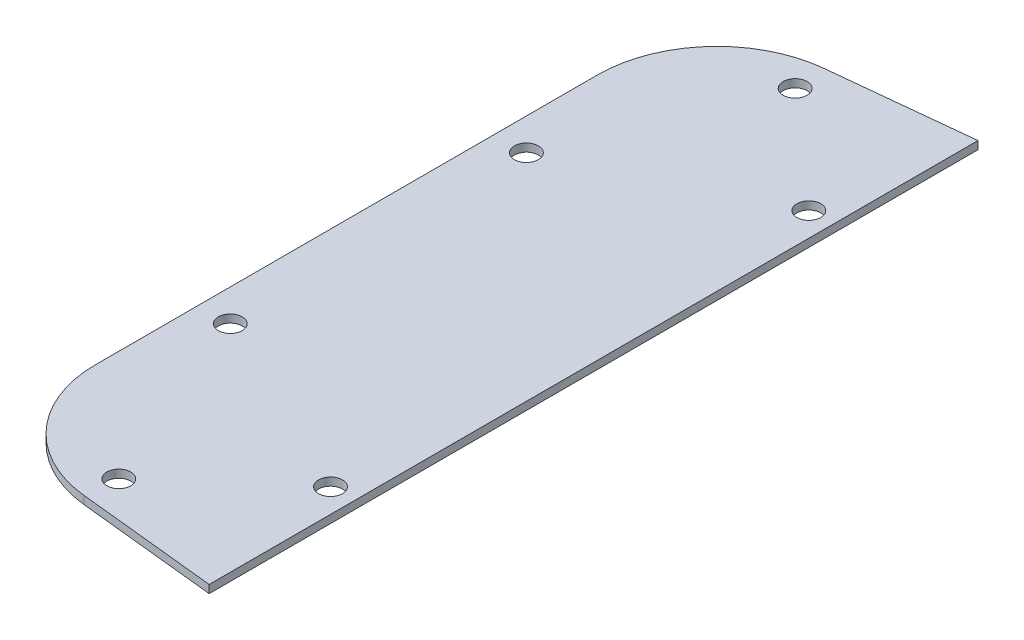
ISO-10303-21;
HEADER;
FILE_DESCRIPTION(('STEP AP214'),'2;1');
FILE_NAME('part.step','',(''),(''),'','','');
FILE_SCHEMA(('AUTOMOTIVE_DESIGN { 1 0 10303 214 1 1 1 1 }'));
ENDSEC;
DATA;
#1=APPLICATION_CONTEXT('core data for automotive mechanical design processes');
#2=APPLICATION_PROTOCOL_DEFINITION('international standard','automotive_design',2000,#1);
#3=PRODUCT_CONTEXT('',#1,'mechanical');
#4=PRODUCT('Part','Part','',(#3));
#5=PRODUCT_RELATED_PRODUCT_CATEGORY('part','',(#4));
#6=PRODUCT_DEFINITION_FORMATION('','',#4);
#7=PRODUCT_DEFINITION_CONTEXT('part definition',#1,'design');
#8=PRODUCT_DEFINITION('design','',#6,#7);
#9=PRODUCT_DEFINITION_SHAPE('','',#8);
#10=(LENGTH_UNIT() NAMED_UNIT(*) SI_UNIT(.MILLI.,.METRE.));
#11=(NAMED_UNIT(*) PLANE_ANGLE_UNIT() SI_UNIT($,.RADIAN.));
#12=(NAMED_UNIT(*) SI_UNIT($,.STERADIAN.) SOLID_ANGLE_UNIT());
#13=UNCERTAINTY_MEASURE_WITH_UNIT(LENGTH_MEASURE(1.E-05),#10,'distance_accuracy_value','');
#14=(GEOMETRIC_REPRESENTATION_CONTEXT(3) GLOBAL_UNCERTAINTY_ASSIGNED_CONTEXT((#13)) GLOBAL_UNIT_ASSIGNED_CONTEXT((#10,
#11,#12)) REPRESENTATION_CONTEXT('',''));
#15=CARTESIAN_POINT('',(0.,0.,0.));
#16=DIRECTION('',(0.,0.,1.));
#17=DIRECTION('',(1.,0.,0.));
#18=AXIS2_PLACEMENT_3D('',#15,#16,#17);
#19=CARTESIAN_POINT('',(-0.499999999999999,0.,32.3589866599045));
#20=DIRECTION('',(0.,1.,0.));
#21=DIRECTION('',(0.,0.,1.));
#22=AXIS2_PLACEMENT_3D('',#19,#20,#21);
#23=PLANE('',#22);
#24=DIRECTION('',(0.,0.,-1.));
#25=VECTOR('',#24,1.);
#26=CARTESIAN_POINT('',(15.5,0.,-47.3423511672905));
#27=LINE('',#26,#25);
#28=CARTESIAN_POINT('',(15.5,0.,49.1031933871649));
#29=VERTEX_POINT('',#28);
#30=CARTESIAN_POINT('',(15.5,0.,-47.3423511672905));
#31=VERTEX_POINT('',#30);
#32=EDGE_CURVE('E214',#29,#31,#27,.T.);
#33=ORIENTED_EDGE('',*,*,#32,.F.);
#34=DIRECTION('',(0.994639530123466,0.,0.103403119468281));
#35=VECTOR('',#34,1.);
#36=CARTESIAN_POINT('',(-2.05104679202422,0.,47.2785796117564));
#37=LINE('',#36,#35);
#38=CARTESIAN_POINT('',(-2.05104679202422,0.,47.2785796117564));
#39=VERTEX_POINT('',#38);
#40=EDGE_CURVE('E255',#39,#29,#37,.T.);
#41=ORIENTED_EDGE('',*,*,#40,.F.);
#42=CARTESIAN_POINT('',(-0.499999999999999,0.,32.3589866599045));
#43=DIRECTION('',(0.,1.,0.));
#44=DIRECTION('',(0.,0.,1.));
#45=AXIS2_PLACEMENT_3D('',#42,#43,#44);
#46=CIRCLE('',#45,15.);
#47=CARTESIAN_POINT('',(-15.5,0.,32.3589866599045));
#48=VERTEX_POINT('',#47);
#49=EDGE_CURVE('E283',#48,#39,#46,.T.);
#50=ORIENTED_EDGE('',*,*,#49,.F.);
#51=DIRECTION('',(0.,0.,1.));
#52=VECTOR('',#51,1.);
#53=CARTESIAN_POINT('',(-15.5,0.,-30.5981444400301));
#54=LINE('',#53,#52);
#55=CARTESIAN_POINT('',(-15.5,0.,-30.5981444400301));
#56=VERTEX_POINT('',#55);
#57=EDGE_CURVE('E280',#56,#48,#54,.T.);
#58=ORIENTED_EDGE('',*,*,#57,.F.);
#59=CARTESIAN_POINT('',(-0.500000000000002,0.,-30.5981444400301));
#60=DIRECTION('',(0.,1.,0.));
#61=DIRECTION('',(0.,0.,1.));
#62=AXIS2_PLACEMENT_3D('',#59,#60,#61);
#63=CIRCLE('',#62,15.);
#64=CARTESIAN_POINT('',(-2.05104679202422,0.,-45.5177373918821));
#65=VERTEX_POINT('',#64);
#66=EDGE_CURVE('E277',#65,#56,#63,.T.);
#67=ORIENTED_EDGE('',*,*,#66,.F.);
#68=DIRECTION('',(-0.994639530123466,0.,0.103403119468281));
#69=VECTOR('',#68,1.);
#70=CARTESIAN_POINT('',(15.5,0.,-47.3423511672905));
#71=LINE('',#70,#69);
#72=EDGE_CURVE('E274',#31,#65,#71,.T.);
#73=ORIENTED_EDGE('',*,*,#72,.F.);
#74=EDGE_LOOP('',(#33,#41,#50,#58,#67,#73));
#75=FACE_BOUND('',#74,.T.);
#76=CARTESIAN_POINT('',(-11.5,0.,-17.6949521456316));
#77=DIRECTION('',(0.,1.,0.));
#78=DIRECTION('',(0.,0.,1.));
#79=AXIS2_PLACEMENT_3D('',#76,#77,#78);
#80=CIRCLE('',#79,1.5);
#81=CARTESIAN_POINT('',(-11.5,0.,-16.1949521456316));
#82=VERTEX_POINT('',#81);
#83=EDGE_CURVE('E220',#82,#82,#80,.F.);
#84=ORIENTED_EDGE('',*,*,#83,.F.);
#85=EDGE_LOOP('',(#84));
#86=FACE_BOUND('',#85,.T.);
#87=CARTESIAN_POINT('',(-11.5,0.,19.455794365506));
#88=DIRECTION('',(0.,1.,0.));
#89=DIRECTION('',(0.,0.,1.));
#90=AXIS2_PLACEMENT_3D('',#87,#88,#89);
#91=CIRCLE('',#90,1.5);
#92=CARTESIAN_POINT('',(-11.5,0.,20.955794365506));
#93=VERTEX_POINT('',#92);
#94=EDGE_CURVE('E228',#93,#93,#91,.F.);
#95=ORIENTED_EDGE('',*,*,#94,.F.);
#96=EDGE_LOOP('',(#95));
#97=FACE_BOUND('',#96,.T.);
#98=CARTESIAN_POINT('',(-1.63743431415109,0.,43.3000214912626));
#99=DIRECTION('',(0.,1.,0.));
#100=DIRECTION('',(0.,0.,1.));
#101=AXIS2_PLACEMENT_3D('',#98,#99,#100);
#102=CIRCLE('',#101,1.5);
#103=CARTESIAN_POINT('',(-1.63743431415109,0.,44.8000214912626));
#104=VERTEX_POINT('',#103);
#105=EDGE_CURVE('E236',#104,#104,#102,.F.);
#106=ORIENTED_EDGE('',*,*,#105,.F.);
#107=EDGE_LOOP('',(#106));
#108=FACE_BOUND('',#107,.T.);
#109=CARTESIAN_POINT('',(12.5,0.,-29.1195788900628));
#110=DIRECTION('',(0.,1.,0.));
#111=DIRECTION('',(0.,0.,1.));
#112=AXIS2_PLACEMENT_3D('',#109,#110,#111);
#113=CIRCLE('',#112,1.5);
#114=CARTESIAN_POINT('',(12.5,0.,-27.6195788900628));
#115=VERTEX_POINT('',#114);
#116=EDGE_CURVE('E219',#115,#115,#113,.F.);
#117=ORIENTED_EDGE('',*,*,#116,.F.);
#118=EDGE_LOOP('',(#117));
#119=FACE_BOUND('',#118,.T.);
#120=CARTESIAN_POINT('',(12.5,0.,30.8804211099372));
#121=DIRECTION('',(0.,1.,0.));
#122=DIRECTION('',(0.,0.,1.));
#123=AXIS2_PLACEMENT_3D('',#120,#121,#122);
#124=CIRCLE('',#123,1.5);
#125=CARTESIAN_POINT('',(12.5,0.,32.3804211099372));
#126=VERTEX_POINT('',#125);
#127=EDGE_CURVE('E195',#126,#126,#124,.F.);
#128=ORIENTED_EDGE('',*,*,#127,.F.);
#129=EDGE_LOOP('',(#128));
#130=FACE_BOUND('',#129,.T.);
#131=CARTESIAN_POINT('',(-1.63743431415109,0.,-41.5391792713882));
#132=DIRECTION('',(0.,1.,0.));
#133=DIRECTION('',(0.,0.,1.));
#134=AXIS2_PLACEMENT_3D('',#131,#132,#133);
#135=CIRCLE('',#134,1.5);
#136=CARTESIAN_POINT('',(-1.63743431415109,0.,-40.0391792713882));
#137=VERTEX_POINT('',#136);
#138=EDGE_CURVE('E210',#137,#137,#135,.F.);
#139=ORIENTED_EDGE('',*,*,#138,.F.);
#140=EDGE_LOOP('',(#139));
#141=FACE_BOUND('',#140,.T.);
#142=CARTESIAN_POINT('',(-11.5,0.,-17.6949521456316));
#143=DIRECTION('',(0.,1.,0.));
#144=DIRECTION('',(0.,0.,-1.));
#145=AXIS2_PLACEMENT_3D('',#142,#143,#144);
#146=CIRCLE('',#145,2.75);
#147=CARTESIAN_POINT('',(-11.3,0.,-14.9522345152511));
#148=VERTEX_POINT('',#147);
#149=CARTESIAN_POINT('',(-11.3,0.,-20.4376697760121));
#150=VERTEX_POINT('',#149);
#151=EDGE_CURVE('E193',#148,#150,#146,.T.);
#152=ORIENTED_EDGE('',*,*,#151,.F.);
#153=DIRECTION('',(0.,0.,-1.));
#154=VECTOR('',#153,1.);
#155=CARTESIAN_POINT('',(-11.3,0.,-14.9522345152511));
#156=LINE('',#155,#154);
#157=CARTESIAN_POINT('',(-11.3,0.,16.7130767351255));
#158=VERTEX_POINT('',#157);
#159=EDGE_CURVE('E190',#158,#148,#156,.T.);
#160=ORIENTED_EDGE('',*,*,#159,.F.);
#161=CARTESIAN_POINT('',(-11.5,0.,19.455794365506));
#162=DIRECTION('',(0.,1.,0.));
#163=DIRECTION('',(0.,0.,-1.));
#164=AXIS2_PLACEMENT_3D('',#161,#162,#163);
#165=CIRCLE('',#164,2.75);
#166=CARTESIAN_POINT('',(-11.3,0.,22.1985119958865));
#167=VERTEX_POINT('',#166);
#168=EDGE_CURVE('E589',#167,#158,#165,.T.);
#169=ORIENTED_EDGE('',*,*,#168,.F.);
#170=DIRECTION('',(0.,0.,-1.));
#171=VECTOR('',#170,1.);
#172=CARTESIAN_POINT('',(-11.3,0.,22.1985119958865));
#173=LINE('',#172,#171);
#174=CARTESIAN_POINT('',(-11.3,0.,32.3589866599045));
#175=VERTEX_POINT('',#174);
#176=EDGE_CURVE('E663',#175,#167,#173,.T.);
#177=ORIENTED_EDGE('',*,*,#176,.F.);
#178=CARTESIAN_POINT('',(-0.499999999999999,0.,32.3589866599045));
#179=DIRECTION('',(0.,-1.,0.));
#180=DIRECTION('',(0.,0.,-1.));
#181=AXIS2_PLACEMENT_3D('',#178,#179,#180);
#182=CIRCLE('',#181,10.8);
#183=CARTESIAN_POINT('',(-4.26301770773381,0.,42.4822123183239));
#184=VERTEX_POINT('',#183);
#185=EDGE_CURVE('E659',#184,#175,#182,.T.);
#186=ORIENTED_EDGE('',*,*,#185,.F.);
#187=CARTESIAN_POINT('',(-1.63743431415109,0.,43.3000214912626));
#188=DIRECTION('',(0.,1.,0.));
#189=DIRECTION('',(0.,0.,-1.));
#190=AXIS2_PLACEMENT_3D('',#187,#188,#189);
#191=CIRCLE('',#190,2.75);
#192=CARTESIAN_POINT('',(1.11126168488556,0.,43.3846991440399));
#193=VERTEX_POINT('',#192);
#194=EDGE_CURVE('E655',#193,#184,#191,.T.);
#195=ORIENTED_EDGE('',*,*,#194,.F.);
#196=DIRECTION('',(-0.994639530123465,0.,-0.103403119468282));
#197=VECTOR('',#196,1.);
#198=CARTESIAN_POINT('',(1.11126168488556,0.,43.3846991440399));
#199=LINE('',#198,#197);
#200=CARTESIAN_POINT('',(9.3,0.,44.2360036223439));
#201=VERTEX_POINT('',#200);
#202=EDGE_CURVE('E651',#201,#193,#199,.T.);
#203=ORIENTED_EDGE('',*,*,#202,.F.);
#204=DIRECTION('',(0.,0.,1.));
#205=VECTOR('',#204,1.);
#206=CARTESIAN_POINT('',(9.3,0.,44.2360036223439));
#207=LINE('',#206,#205);
#208=CARTESIAN_POINT('',(9.29999999999999,0.,-42.4751614024695));
#209=VERTEX_POINT('',#208);
#210=EDGE_CURVE('E647',#209,#201,#207,.T.);
#211=ORIENTED_EDGE('',*,*,#210,.F.);
#212=DIRECTION('',(0.994639530123466,0.,-0.103403119468281));
#213=VECTOR('',#212,1.);
#214=CARTESIAN_POINT('',(9.29999999999999,0.,-42.4751614024695));
#215=LINE('',#214,#213);
#216=CARTESIAN_POINT('',(1.11126168488556,0.,-41.6238569241655));
#217=VERTEX_POINT('',#216);
#218=EDGE_CURVE('E639',#217,#209,#215,.T.);
#219=ORIENTED_EDGE('',*,*,#218,.F.);
#220=CARTESIAN_POINT('',(-1.63743431415109,0.,-41.5391792713882));
#221=DIRECTION('',(0.,1.,0.));
#222=DIRECTION('',(0.,0.,-1.));
#223=AXIS2_PLACEMENT_3D('',#220,#221,#222);
#224=CIRCLE('',#223,2.75);
#225=CARTESIAN_POINT('',(-4.26301770773382,0.,-40.7213700984495));
#226=VERTEX_POINT('',#225);
#227=EDGE_CURVE('E633',#226,#217,#224,.T.);
#228=ORIENTED_EDGE('',*,*,#227,.F.);
#229=CARTESIAN_POINT('',(-0.500000000000002,0.,-30.5981444400301));
#230=DIRECTION('',(0.,-1.,0.));
#231=DIRECTION('',(0.,0.,-1.));
#232=AXIS2_PLACEMENT_3D('',#229,#230,#231);
#233=CIRCLE('',#232,10.8);
#234=CARTESIAN_POINT('',(-11.3,0.,-30.5981444400301));
#235=VERTEX_POINT('',#234);
#236=EDGE_CURVE('E66',#235,#226,#233,.T.);
#237=ORIENTED_EDGE('',*,*,#236,.F.);
#238=DIRECTION('',(0.,0.,-1.));
#239=VECTOR('',#238,1.);
#240=CARTESIAN_POINT('',(-11.3,0.,-30.5981444400301));
#241=LINE('',#240,#239);
#242=EDGE_CURVE('E61',#150,#235,#241,.T.);
#243=ORIENTED_EDGE('',*,*,#242,.F.);
#244=EDGE_LOOP('',(#152,#160,#169,#177,#186,#195,#203,#211,#219,#228,#237,#243));
#245=FACE_BOUND('',#244,.T.);
#246=ADVANCED_FACE('F45',(#75,#86,#97,#108,#119,#130,#141,#245),#23,.F.);
#247=CARTESIAN_POINT('',(15.5,1.,-47.3423511672905));
#248=DIRECTION('',(-1.,0.,0.));
#249=DIRECTION('',(0.,0.,1.));
#250=AXIS2_PLACEMENT_3D('',#247,#248,#249);
#251=PLANE('',#250);
#252=ORIENTED_EDGE('',*,*,#32,.T.);
#253=DIRECTION('',(0.,-1.,0.));
#254=VECTOR('',#253,1.);
#255=CARTESIAN_POINT('',(15.5,1.,-47.3423511672905));
#256=LINE('',#255,#254);
#257=CARTESIAN_POINT('',(15.5,1.,-47.3423511672905));
#258=VERTEX_POINT('',#257);
#259=EDGE_CURVE('E11',#258,#31,#256,.T.);
#260=ORIENTED_EDGE('',*,*,#259,.F.);
#261=DIRECTION('',(0.,0.,-1.));
#262=VECTOR('',#261,1.);
#263=CARTESIAN_POINT('',(15.5,1.,-47.3423511672905));
#264=LINE('',#263,#262);
#265=CARTESIAN_POINT('',(15.5,1.,49.1031933871649));
#266=VERTEX_POINT('',#265);
#267=EDGE_CURVE('E250',#266,#258,#264,.T.);
#268=ORIENTED_EDGE('',*,*,#267,.F.);
#269=DIRECTION('',(0.,-1.,0.));
#270=VECTOR('',#269,1.);
#271=CARTESIAN_POINT('',(15.5,1.,49.1031933871649));
#272=LINE('',#271,#270);
#273=EDGE_CURVE('E270',#266,#29,#272,.T.);
#274=ORIENTED_EDGE('',*,*,#273,.T.);
#275=EDGE_LOOP('',(#252,#260,#268,#274));
#276=FACE_BOUND('',#275,.T.);
#277=ADVANCED_FACE('F47',(#276),#251,.F.);
#278=CARTESIAN_POINT('',(15.5,1.,-47.3423511672905));
#279=DIRECTION('',(0.103403119468281,0.,0.994639530123466));
#280=DIRECTION('',(0.994639530123466,0.,-0.103403119468281));
#281=AXIS2_PLACEMENT_3D('',#278,#279,#280);
#282=PLANE('',#281);
#283=ORIENTED_EDGE('',*,*,#72,.T.);
#284=DIRECTION('',(0.,-1.,0.));
#285=VECTOR('',#284,1.);
#286=CARTESIAN_POINT('',(-2.05104679202422,1.,-45.5177373918821));
#287=LINE('',#286,#285);
#288=CARTESIAN_POINT('',(-2.05104679202422,1.,-45.5177373918821));
#289=VERTEX_POINT('',#288);
#290=EDGE_CURVE('E54',#289,#65,#287,.T.);
#291=ORIENTED_EDGE('',*,*,#290,.F.);
#292=DIRECTION('',(-0.994639530123466,0.,0.103403119468281));
#293=VECTOR('',#292,1.);
#294=CARTESIAN_POINT('',(15.5,1.,-47.3423511672905));
#295=LINE('',#294,#293);
#296=EDGE_CURVE('E254',#258,#289,#295,.T.);
#297=ORIENTED_EDGE('',*,*,#296,.F.);
#298=ORIENTED_EDGE('',*,*,#259,.T.);
#299=EDGE_LOOP('',(#283,#291,#297,#298));
#300=FACE_BOUND('',#299,.T.);
#301=ADVANCED_FACE('F331',(#300),#282,.F.);
#302=CARTESIAN_POINT('',(-0.500000000000002,1.,-30.5981444400301));
#303=DIRECTION('',(0.,-1.,0.));
#304=DIRECTION('',(0.,0.,-1.));
#305=AXIS2_PLACEMENT_3D('',#302,#303,#304);
#306=CYLINDRICAL_SURFACE('',#305,15.);
#307=ORIENTED_EDGE('',*,*,#66,.T.);
#308=DIRECTION('',(0.,-1.,0.));
#309=VECTOR('',#308,1.);
#310=CARTESIAN_POINT('',(-15.5,1.,-30.5981444400301));
#311=LINE('',#310,#309);
#312=CARTESIAN_POINT('',(-15.5,1.,-30.5981444400301));
#313=VERTEX_POINT('',#312);
#314=EDGE_CURVE('E299',#313,#56,#311,.T.);
#315=ORIENTED_EDGE('',*,*,#314,.F.);
#316=CARTESIAN_POINT('',(-0.500000000000002,1.,-30.5981444400301));
#317=DIRECTION('',(0.,1.,0.));
#318=DIRECTION('',(0.,0.,1.));
#319=AXIS2_PLACEMENT_3D('',#316,#317,#318);
#320=CIRCLE('',#319,15.);
#321=EDGE_CURVE('E258',#289,#313,#320,.T.);
#322=ORIENTED_EDGE('',*,*,#321,.F.);
#323=ORIENTED_EDGE('',*,*,#290,.T.);
#324=EDGE_LOOP('',(#307,#315,#322,#323));
#325=FACE_BOUND('',#324,.T.);
#326=ADVANCED_FACE('F308',(#325),#306,.T.);
#327=CARTESIAN_POINT('',(-15.5,1.,-30.5981444400301));
#328=DIRECTION('',(1.,0.,0.));
#329=DIRECTION('',(0.,0.,-1.));
#330=AXIS2_PLACEMENT_3D('',#327,#328,#329);
#331=PLANE('',#330);
#332=ORIENTED_EDGE('',*,*,#57,.T.);
#333=DIRECTION('',(0.,-1.,0.));
#334=VECTOR('',#333,1.);
#335=CARTESIAN_POINT('',(-15.5,1.,32.3589866599045));
#336=LINE('',#335,#334);
#337=CARTESIAN_POINT('',(-15.5,1.,32.3589866599045));
#338=VERTEX_POINT('',#337);
#339=EDGE_CURVE('E295',#338,#48,#336,.T.);
#340=ORIENTED_EDGE('',*,*,#339,.F.);
#341=DIRECTION('',(0.,0.,1.));
#342=VECTOR('',#341,1.);
#343=CARTESIAN_POINT('',(-15.5,1.,-30.5981444400301));
#344=LINE('',#343,#342);
#345=EDGE_CURVE('E261',#313,#338,#344,.T.);
#346=ORIENTED_EDGE('',*,*,#345,.F.);
#347=ORIENTED_EDGE('',*,*,#314,.T.);
#348=EDGE_LOOP('',(#332,#340,#346,#347));
#349=FACE_BOUND('',#348,.T.);
#350=ADVANCED_FACE('F319',(#349),#331,.F.);
#351=CARTESIAN_POINT('',(-0.499999999999999,1.,32.3589866599045));
#352=DIRECTION('',(0.,-1.,0.));
#353=DIRECTION('',(0.,0.,-1.));
#354=AXIS2_PLACEMENT_3D('',#351,#352,#353);
#355=CYLINDRICAL_SURFACE('',#354,15.);
#356=ORIENTED_EDGE('',*,*,#49,.T.);
#357=DIRECTION('',(0.,-1.,0.));
#358=VECTOR('',#357,1.);
#359=CARTESIAN_POINT('',(-2.05104679202422,1.,47.2785796117564));
#360=LINE('',#359,#358);
#361=CARTESIAN_POINT('',(-2.05104679202422,1.,47.2785796117564));
#362=VERTEX_POINT('',#361);
#363=EDGE_CURVE('E291',#362,#39,#360,.T.);
#364=ORIENTED_EDGE('',*,*,#363,.F.);
#365=CARTESIAN_POINT('',(-0.499999999999999,1.,32.3589866599045));
#366=DIRECTION('',(0.,1.,0.));
#367=DIRECTION('',(0.,0.,1.));
#368=AXIS2_PLACEMENT_3D('',#365,#366,#367);
#369=CIRCLE('',#368,15.);
#370=EDGE_CURVE('E264',#338,#362,#369,.T.);
#371=ORIENTED_EDGE('',*,*,#370,.F.);
#372=ORIENTED_EDGE('',*,*,#339,.T.);
#373=EDGE_LOOP('',(#356,#364,#371,#372));
#374=FACE_BOUND('',#373,.T.);
#375=ADVANCED_FACE('F323',(#374),#355,.T.);
#376=CARTESIAN_POINT('',(-2.05104679202422,1.,47.2785796117564));
#377=DIRECTION('',(0.103403119468281,0.,-0.994639530123466));
#378=DIRECTION('',(-0.994639530123466,0.,-0.103403119468281));
#379=AXIS2_PLACEMENT_3D('',#376,#377,#378);
#380=PLANE('',#379);
#381=ORIENTED_EDGE('',*,*,#40,.T.);
#382=ORIENTED_EDGE('',*,*,#273,.F.);
#383=DIRECTION('',(0.994639530123466,0.,0.103403119468281));
#384=VECTOR('',#383,1.);
#385=CARTESIAN_POINT('',(-2.05104679202422,1.,47.2785796117564));
#386=LINE('',#385,#384);
#387=EDGE_CURVE('E267',#362,#266,#386,.T.);
#388=ORIENTED_EDGE('',*,*,#387,.F.);
#389=ORIENTED_EDGE('',*,*,#363,.T.);
#390=EDGE_LOOP('',(#381,#382,#388,#389));
#391=FACE_BOUND('',#390,.T.);
#392=ADVANCED_FACE('F334',(#391),#380,.F.);
#393=CARTESIAN_POINT('',(-0.499999999999999,1.,32.3589866599045));
#394=DIRECTION('',(0.,1.,0.));
#395=DIRECTION('',(0.,0.,1.));
#396=AXIS2_PLACEMENT_3D('',#393,#394,#395);
#397=PLANE('',#396);
#398=CARTESIAN_POINT('',(-1.63743431415109,1.,-41.5391792713882));
#399=DIRECTION('',(0.,1.,0.));
#400=DIRECTION('',(0.,0.,1.));
#401=AXIS2_PLACEMENT_3D('',#398,#399,#400);
#402=CIRCLE('',#401,1.5);
#403=CARTESIAN_POINT('',(-1.63743431415109,1.,-40.0391792713882));
#404=VERTEX_POINT('',#403);
#405=EDGE_CURVE('E206',#404,#404,#402,.T.);
#406=ORIENTED_EDGE('',*,*,#405,.F.);
#407=EDGE_LOOP('',(#406));
#408=FACE_BOUND('',#407,.T.);
#409=CARTESIAN_POINT('',(12.5,1.,30.8804211099372));
#410=DIRECTION('',(0.,1.,0.));
#411=DIRECTION('',(0.,0.,1.));
#412=AXIS2_PLACEMENT_3D('',#409,#410,#411);
#413=CIRCLE('',#412,1.5);
#414=CARTESIAN_POINT('',(12.5,1.,32.3804211099372));
#415=VERTEX_POINT('',#414);
#416=EDGE_CURVE('E200',#415,#415,#413,.T.);
#417=ORIENTED_EDGE('',*,*,#416,.F.);
#418=EDGE_LOOP('',(#417));
#419=FACE_BOUND('',#418,.T.);
#420=CARTESIAN_POINT('',(12.5,1.,-29.1195788900628));
#421=DIRECTION('',(0.,1.,0.));
#422=DIRECTION('',(0.,0.,1.));
#423=AXIS2_PLACEMENT_3D('',#420,#421,#422);
#424=CIRCLE('',#423,1.5);
#425=CARTESIAN_POINT('',(12.5,1.,-27.6195788900628));
#426=VERTEX_POINT('',#425);
#427=EDGE_CURVE('E240',#426,#426,#424,.T.);
#428=ORIENTED_EDGE('',*,*,#427,.F.);
#429=EDGE_LOOP('',(#428));
#430=FACE_BOUND('',#429,.T.);
#431=CARTESIAN_POINT('',(-1.63743431415109,1.,43.3000214912626));
#432=DIRECTION('',(0.,1.,0.));
#433=DIRECTION('',(0.,0.,1.));
#434=AXIS2_PLACEMENT_3D('',#431,#432,#433);
#435=CIRCLE('',#434,1.5);
#436=CARTESIAN_POINT('',(-1.63743431415109,1.,44.8000214912626));
#437=VERTEX_POINT('',#436);
#438=EDGE_CURVE('E232',#437,#437,#435,.T.);
#439=ORIENTED_EDGE('',*,*,#438,.F.);
#440=EDGE_LOOP('',(#439));
#441=FACE_BOUND('',#440,.T.);
#442=CARTESIAN_POINT('',(-11.5,1.,19.455794365506));
#443=DIRECTION('',(0.,1.,0.));
#444=DIRECTION('',(0.,0.,1.));
#445=AXIS2_PLACEMENT_3D('',#442,#443,#444);
#446=CIRCLE('',#445,1.5);
#447=CARTESIAN_POINT('',(-11.5,1.,20.955794365506));
#448=VERTEX_POINT('',#447);
#449=EDGE_CURVE('E224',#448,#448,#446,.T.);
#450=ORIENTED_EDGE('',*,*,#449,.F.);
#451=EDGE_LOOP('',(#450));
#452=FACE_BOUND('',#451,.T.);
#453=CARTESIAN_POINT('',(-11.5,1.,-17.6949521456316));
#454=DIRECTION('',(0.,1.,0.));
#455=DIRECTION('',(0.,0.,1.));
#456=AXIS2_PLACEMENT_3D('',#453,#454,#455);
#457=CIRCLE('',#456,1.5);
#458=CARTESIAN_POINT('',(-11.5,1.,-16.1949521456316));
#459=VERTEX_POINT('',#458);
#460=EDGE_CURVE('E211',#459,#459,#457,.T.);
#461=ORIENTED_EDGE('',*,*,#460,.F.);
#462=EDGE_LOOP('',(#461));
#463=FACE_BOUND('',#462,.T.);
#464=ORIENTED_EDGE('',*,*,#267,.T.);
#465=ORIENTED_EDGE('',*,*,#296,.T.);
#466=ORIENTED_EDGE('',*,*,#321,.T.);
#467=ORIENTED_EDGE('',*,*,#345,.T.);
#468=ORIENTED_EDGE('',*,*,#370,.T.);
#469=ORIENTED_EDGE('',*,*,#387,.T.);
#470=EDGE_LOOP('',(#464,#465,#466,#467,#468,#469));
#471=FACE_BOUND('',#470,.T.);
#472=ADVANCED_FACE('F327',(#408,#419,#430,#441,#452,#463,#471),#397,.T.);
#473=CARTESIAN_POINT('',(-11.5,-0.000999999999999916,-17.6949521456316));
#474=DIRECTION('',(0.,1.,0.));
#475=DIRECTION('',(0.,0.,1.));
#476=AXIS2_PLACEMENT_3D('',#473,#474,#475);
#477=CYLINDRICAL_SURFACE('',#476,1.5);
#478=ORIENTED_EDGE('',*,*,#460,.T.);
#479=EDGE_LOOP('',(#478));
#480=FACE_BOUND('',#479,.T.);
#481=ORIENTED_EDGE('',*,*,#83,.T.);
#482=EDGE_LOOP('',(#481));
#483=FACE_BOUND('',#482,.T.);
#484=ADVANCED_FACE('F341',(#480,#483),#477,.F.);
#485=CARTESIAN_POINT('',(-11.5,-0.000999999999999916,19.455794365506));
#486=DIRECTION('',(0.,1.,0.));
#487=DIRECTION('',(0.,0.,1.));
#488=AXIS2_PLACEMENT_3D('',#485,#486,#487);
#489=CYLINDRICAL_SURFACE('',#488,1.5);
#490=ORIENTED_EDGE('',*,*,#449,.T.);
#491=EDGE_LOOP('',(#490));
#492=FACE_BOUND('',#491,.T.);
#493=ORIENTED_EDGE('',*,*,#94,.T.);
#494=EDGE_LOOP('',(#493));
#495=FACE_BOUND('',#494,.T.);
#496=ADVANCED_FACE('F361',(#492,#495),#489,.F.);
#497=CARTESIAN_POINT('',(-1.63743431415109,-0.000999999999999916,43.3000214912626));
#498=DIRECTION('',(0.,1.,0.));
#499=DIRECTION('',(0.,0.,1.));
#500=AXIS2_PLACEMENT_3D('',#497,#498,#499);
#501=CYLINDRICAL_SURFACE('',#500,1.5);
#502=ORIENTED_EDGE('',*,*,#438,.T.);
#503=EDGE_LOOP('',(#502));
#504=FACE_BOUND('',#503,.T.);
#505=ORIENTED_EDGE('',*,*,#105,.T.);
#506=EDGE_LOOP('',(#505));
#507=FACE_BOUND('',#506,.T.);
#508=ADVANCED_FACE('F357',(#504,#507),#501,.F.);
#509=CARTESIAN_POINT('',(12.5,-0.000999999999999916,-29.1195788900628));
#510=DIRECTION('',(0.,1.,0.));
#511=DIRECTION('',(0.,0.,1.));
#512=AXIS2_PLACEMENT_3D('',#509,#510,#511);
#513=CYLINDRICAL_SURFACE('',#512,1.5);
#514=ORIENTED_EDGE('',*,*,#427,.T.);
#515=EDGE_LOOP('',(#514));
#516=FACE_BOUND('',#515,.T.);
#517=ORIENTED_EDGE('',*,*,#116,.T.);
#518=EDGE_LOOP('',(#517));
#519=FACE_BOUND('',#518,.T.);
#520=ADVANCED_FACE('F353',(#516,#519),#513,.F.);
#521=CARTESIAN_POINT('',(12.5,-0.000999999999999916,30.8804211099372));
#522=DIRECTION('',(0.,1.,0.));
#523=DIRECTION('',(0.,0.,1.));
#524=AXIS2_PLACEMENT_3D('',#521,#522,#523);
#525=CYLINDRICAL_SURFACE('',#524,1.5);
#526=ORIENTED_EDGE('',*,*,#416,.T.);
#527=EDGE_LOOP('',(#526));
#528=FACE_BOUND('',#527,.T.);
#529=ORIENTED_EDGE('',*,*,#127,.T.);
#530=EDGE_LOOP('',(#529));
#531=FACE_BOUND('',#530,.T.);
#532=ADVANCED_FACE('F356',(#528,#531),#525,.F.);
#533=CARTESIAN_POINT('',(-1.63743431415109,-0.000999999999999916,-41.5391792713882));
#534=DIRECTION('',(0.,1.,0.));
#535=DIRECTION('',(0.,0.,1.));
#536=AXIS2_PLACEMENT_3D('',#533,#534,#535);
#537=CYLINDRICAL_SURFACE('',#536,1.5);
#538=ORIENTED_EDGE('',*,*,#405,.T.);
#539=EDGE_LOOP('',(#538));
#540=FACE_BOUND('',#539,.T.);
#541=ORIENTED_EDGE('',*,*,#138,.T.);
#542=EDGE_LOOP('',(#541));
#543=FACE_BOUND('',#542,.T.);
#544=ADVANCED_FACE('F371',(#540,#543),#537,.F.);
#545=CARTESIAN_POINT('',(-11.5,-0.5,-17.6949521456316));
#546=DIRECTION('',(0.,1.,0.));
#547=DIRECTION('',(0.,0.,1.));
#548=AXIS2_PLACEMENT_3D('',#545,#546,#547);
#549=CYLINDRICAL_SURFACE('',#548,2.75);
#550=ORIENTED_EDGE('',*,*,#151,.T.);
#551=DIRECTION('',(0.,1.,0.));
#552=VECTOR('',#551,1.);
#553=CARTESIAN_POINT('',(-11.3,-0.5,-20.4376697760121));
#554=LINE('',#553,#552);
#555=CARTESIAN_POINT('',(-11.3,-0.5,-20.4376697760121));
#556=VERTEX_POINT('',#555);
#557=EDGE_CURVE('E172',#556,#150,#554,.T.);
#558=ORIENTED_EDGE('',*,*,#557,.F.);
#559=CARTESIAN_POINT('',(-11.5,-0.5,-17.6949521456316));
#560=DIRECTION('',(0.,1.,0.));
#561=DIRECTION('',(0.,0.,-1.));
#562=AXIS2_PLACEMENT_3D('',#559,#560,#561);
#563=CIRCLE('',#562,2.75);
#564=CARTESIAN_POINT('',(-11.3,-0.5,-14.9522345152511));
#565=VERTEX_POINT('',#564);
#566=EDGE_CURVE('E180',#565,#556,#563,.T.);
#567=ORIENTED_EDGE('',*,*,#566,.F.);
#568=DIRECTION('',(0.,1.,0.));
#569=VECTOR('',#568,1.);
#570=CARTESIAN_POINT('',(-11.3,-0.5,-14.9522345152511));
#571=LINE('',#570,#569);
#572=EDGE_CURVE('E584',#565,#148,#571,.T.);
#573=ORIENTED_EDGE('',*,*,#572,.T.);
#574=EDGE_LOOP('',(#550,#558,#567,#573));
#575=FACE_BOUND('',#574,.T.);
#576=ADVANCED_FACE('F192',(#575),#549,.F.);
#577=CARTESIAN_POINT('',(-11.3,-0.5,-30.5981444400301));
#578=DIRECTION('',(1.,0.,0.));
#579=DIRECTION('',(0.,0.,-1.));
#580=AXIS2_PLACEMENT_3D('',#577,#578,#579);
#581=PLANE('',#580);
#582=ORIENTED_EDGE('',*,*,#242,.T.);
#583=DIRECTION('',(0.,1.,0.));
#584=VECTOR('',#583,1.);
#585=CARTESIAN_POINT('',(-11.3,-0.5,-30.5981444400301));
#586=LINE('',#585,#584);
#587=CARTESIAN_POINT('',(-11.3,-0.5,-30.5981444400301));
#588=VERTEX_POINT('',#587);
#589=EDGE_CURVE('E175',#588,#235,#586,.T.);
#590=ORIENTED_EDGE('',*,*,#589,.F.);
#591=DIRECTION('',(0.,0.,-1.));
#592=VECTOR('',#591,1.);
#593=CARTESIAN_POINT('',(-11.3,-0.5,-30.5981444400301));
#594=LINE('',#593,#592);
#595=EDGE_CURVE('E168',#556,#588,#594,.T.);
#596=ORIENTED_EDGE('',*,*,#595,.F.);
#597=ORIENTED_EDGE('',*,*,#557,.T.);
#598=EDGE_LOOP('',(#582,#590,#596,#597));
#599=FACE_BOUND('',#598,.T.);
#600=ADVANCED_FACE('F170',(#599),#581,.F.);
#601=CARTESIAN_POINT('',(-0.500000000000002,-0.5,-30.5981444400301));
#602=DIRECTION('',(0.,1.,0.));
#603=DIRECTION('',(0.,0.,1.));
#604=AXIS2_PLACEMENT_3D('',#601,#602,#603);
#605=CYLINDRICAL_SURFACE('',#604,10.8);
#606=ORIENTED_EDGE('',*,*,#236,.T.);
#607=DIRECTION('',(0.,1.,0.));
#608=VECTOR('',#607,1.);
#609=CARTESIAN_POINT('',(-4.26301770773382,-0.5,-40.7213700984495));
#610=LINE('',#609,#608);
#611=CARTESIAN_POINT('',(-4.26301770773382,-0.5,-40.7213700984495));
#612=VERTEX_POINT('',#611);
#613=EDGE_CURVE('E202',#612,#226,#610,.T.);
#614=ORIENTED_EDGE('',*,*,#613,.F.);
#615=CARTESIAN_POINT('',(-0.500000000000002,-0.5,-30.5981444400301));
#616=DIRECTION('',(0.,-1.,0.));
#617=DIRECTION('',(0.,0.,-1.));
#618=AXIS2_PLACEMENT_3D('',#615,#616,#617);
#619=CIRCLE('',#618,10.8);
#620=EDGE_CURVE('E179',#588,#612,#619,.T.);
#621=ORIENTED_EDGE('',*,*,#620,.F.);
#622=ORIENTED_EDGE('',*,*,#589,.T.);
#623=EDGE_LOOP('',(#606,#614,#621,#622));
#624=FACE_BOUND('',#623,.T.);
#625=ADVANCED_FACE('F378',(#624),#605,.T.);
#626=CARTESIAN_POINT('',(-1.63743431415109,-0.5,-41.5391792713882));
#627=DIRECTION('',(0.,1.,0.));
#628=DIRECTION('',(0.,0.,1.));
#629=AXIS2_PLACEMENT_3D('',#626,#627,#628);
#630=CYLINDRICAL_SURFACE('',#629,2.75);
#631=ORIENTED_EDGE('',*,*,#227,.T.);
#632=DIRECTION('',(0.,1.,0.));
#633=VECTOR('',#632,1.);
#634=CARTESIAN_POINT('',(1.11126168488556,-0.5,-41.6238569241655));
#635=LINE('',#634,#633);
#636=CARTESIAN_POINT('',(1.11126168488556,-0.5,-41.6238569241655));
#637=VERTEX_POINT('',#636);
#638=EDGE_CURVE('E624',#637,#217,#635,.T.);
#639=ORIENTED_EDGE('',*,*,#638,.F.);
#640=CARTESIAN_POINT('',(-1.63743431415109,-0.5,-41.5391792713882));
#641=DIRECTION('',(0.,1.,0.));
#642=DIRECTION('',(0.,0.,-1.));
#643=AXIS2_PLACEMENT_3D('',#640,#641,#642);
#644=CIRCLE('',#643,2.75);
#645=EDGE_CURVE('E634',#612,#637,#644,.T.);
#646=ORIENTED_EDGE('',*,*,#645,.F.);
#647=ORIENTED_EDGE('',*,*,#613,.T.);
#648=EDGE_LOOP('',(#631,#639,#646,#647));
#649=FACE_BOUND('',#648,.T.);
#650=ADVANCED_FACE('F381',(#649),#630,.F.);
#651=CARTESIAN_POINT('',(9.29999999999999,-0.5,-42.4751614024695));
#652=DIRECTION('',(0.103403119468281,0.,0.994639530123466));
#653=DIRECTION('',(0.994639530123466,0.,-0.103403119468281));
#654=AXIS2_PLACEMENT_3D('',#651,#652,#653);
#655=PLANE('',#654);
#656=ORIENTED_EDGE('',*,*,#218,.T.);
#657=DIRECTION('',(0.,1.,0.));
#658=VECTOR('',#657,1.);
#659=CARTESIAN_POINT('',(9.29999999999999,-0.5,-42.4751614024695));
#660=LINE('',#659,#658);
#661=CARTESIAN_POINT('',(9.29999999999999,-0.5,-42.4751614024695));
#662=VERTEX_POINT('',#661);
#663=EDGE_CURVE('E620',#662,#209,#660,.T.);
#664=ORIENTED_EDGE('',*,*,#663,.F.);
#665=DIRECTION('',(0.994639530123466,0.,-0.103403119468281));
#666=VECTOR('',#665,1.);
#667=CARTESIAN_POINT('',(9.29999999999999,-0.5,-42.4751614024695));
#668=LINE('',#667,#666);
#669=EDGE_CURVE('E685',#637,#662,#668,.T.);
#670=ORIENTED_EDGE('',*,*,#669,.F.);
#671=ORIENTED_EDGE('',*,*,#638,.T.);
#672=EDGE_LOOP('',(#656,#664,#670,#671));
#673=FACE_BOUND('',#672,.T.);
#674=ADVANCED_FACE('F385',(#673),#655,.F.);
#675=CARTESIAN_POINT('',(9.3,-0.5,44.2360036223439));
#676=DIRECTION('',(-1.,0.,0.));
#677=DIRECTION('',(0.,0.,1.));
#678=AXIS2_PLACEMENT_3D('',#675,#676,#677);
#679=PLANE('',#678);
#680=ORIENTED_EDGE('',*,*,#210,.T.);
#681=DIRECTION('',(0.,1.,0.));
#682=VECTOR('',#681,1.);
#683=CARTESIAN_POINT('',(9.3,-0.5,44.2360036223439));
#684=LINE('',#683,#682);
#685=CARTESIAN_POINT('',(9.3,-0.5,44.2360036223439));
#686=VERTEX_POINT('',#685);
#687=EDGE_CURVE('E616',#686,#201,#684,.T.);
#688=ORIENTED_EDGE('',*,*,#687,.F.);
#689=DIRECTION('',(0.,0.,1.));
#690=VECTOR('',#689,1.);
#691=CARTESIAN_POINT('',(9.3,-0.5,44.2360036223439));
#692=LINE('',#691,#690);
#693=EDGE_CURVE('E683',#662,#686,#692,.T.);
#694=ORIENTED_EDGE('',*,*,#693,.F.);
#695=ORIENTED_EDGE('',*,*,#663,.T.);
#696=EDGE_LOOP('',(#680,#688,#694,#695));
#697=FACE_BOUND('',#696,.T.);
#698=ADVANCED_FACE('F389',(#697),#679,.F.);
#699=CARTESIAN_POINT('',(1.11126168488556,-0.5,43.3846991440399));
#700=DIRECTION('',(0.103403119468282,0.,-0.994639530123466));
#701=DIRECTION('',(-0.994639530123466,0.,-0.103403119468282));
#702=AXIS2_PLACEMENT_3D('',#699,#700,#701);
#703=PLANE('',#702);
#704=ORIENTED_EDGE('',*,*,#202,.T.);
#705=DIRECTION('',(0.,1.,0.));
#706=VECTOR('',#705,1.);
#707=CARTESIAN_POINT('',(1.11126168488556,-0.5,43.3846991440399));
#708=LINE('',#707,#706);
#709=CARTESIAN_POINT('',(1.11126168488556,-0.5,43.3846991440399));
#710=VERTEX_POINT('',#709);
#711=EDGE_CURVE('E612',#710,#193,#708,.T.);
#712=ORIENTED_EDGE('',*,*,#711,.F.);
#713=DIRECTION('',(-0.994639530123465,0.,-0.103403119468282));
#714=VECTOR('',#713,1.);
#715=CARTESIAN_POINT('',(1.11126168488556,-0.5,43.3846991440399));
#716=LINE('',#715,#714);
#717=EDGE_CURVE('E679',#686,#710,#716,.T.);
#718=ORIENTED_EDGE('',*,*,#717,.F.);
#719=ORIENTED_EDGE('',*,*,#687,.T.);
#720=EDGE_LOOP('',(#704,#712,#718,#719));
#721=FACE_BOUND('',#720,.T.);
#722=ADVANCED_FACE('F393',(#721),#703,.F.);
#723=CARTESIAN_POINT('',(-1.63743431415109,-0.5,43.3000214912626));
#724=DIRECTION('',(0.,1.,0.));
#725=DIRECTION('',(0.,0.,1.));
#726=AXIS2_PLACEMENT_3D('',#723,#724,#725);
#727=CYLINDRICAL_SURFACE('',#726,2.75);
#728=ORIENTED_EDGE('',*,*,#194,.T.);
#729=DIRECTION('',(0.,1.,0.));
#730=VECTOR('',#729,1.);
#731=CARTESIAN_POINT('',(-4.26301770773381,-0.5,42.4822123183239));
#732=LINE('',#731,#730);
#733=CARTESIAN_POINT('',(-4.26301770773381,-0.5,42.4822123183239));
#734=VERTEX_POINT('',#733);
#735=EDGE_CURVE('E608',#734,#184,#732,.T.);
#736=ORIENTED_EDGE('',*,*,#735,.F.);
#737=CARTESIAN_POINT('',(-1.63743431415109,-0.5,43.3000214912626));
#738=DIRECTION('',(0.,1.,0.));
#739=DIRECTION('',(0.,0.,-1.));
#740=AXIS2_PLACEMENT_3D('',#737,#738,#739);
#741=CIRCLE('',#740,2.75);
#742=EDGE_CURVE('E677',#710,#734,#741,.T.);
#743=ORIENTED_EDGE('',*,*,#742,.F.);
#744=ORIENTED_EDGE('',*,*,#711,.T.);
#745=EDGE_LOOP('',(#728,#736,#743,#744));
#746=FACE_BOUND('',#745,.T.);
#747=ADVANCED_FACE('F397',(#746),#727,.F.);
#748=CARTESIAN_POINT('',(-0.499999999999999,-0.5,32.3589866599045));
#749=DIRECTION('',(0.,1.,0.));
#750=DIRECTION('',(0.,0.,1.));
#751=AXIS2_PLACEMENT_3D('',#748,#749,#750);
#752=CYLINDRICAL_SURFACE('',#751,10.8);
#753=ORIENTED_EDGE('',*,*,#185,.T.);
#754=DIRECTION('',(0.,1.,0.));
#755=VECTOR('',#754,1.);
#756=CARTESIAN_POINT('',(-11.3,-0.5,32.3589866599045));
#757=LINE('',#756,#755);
#758=CARTESIAN_POINT('',(-11.3,-0.5,32.3589866599045));
#759=VERTEX_POINT('',#758);
#760=EDGE_CURVE('E604',#759,#175,#757,.T.);
#761=ORIENTED_EDGE('',*,*,#760,.F.);
#762=CARTESIAN_POINT('',(-0.499999999999999,-0.5,32.3589866599045));
#763=DIRECTION('',(0.,-1.,0.));
#764=DIRECTION('',(0.,0.,-1.));
#765=AXIS2_PLACEMENT_3D('',#762,#763,#764);
#766=CIRCLE('',#765,10.8);
#767=EDGE_CURVE('E673',#734,#759,#766,.T.);
#768=ORIENTED_EDGE('',*,*,#767,.F.);
#769=ORIENTED_EDGE('',*,*,#735,.T.);
#770=EDGE_LOOP('',(#753,#761,#768,#769));
#771=FACE_BOUND('',#770,.T.);
#772=ADVANCED_FACE('F401',(#771),#752,.T.);
#773=CARTESIAN_POINT('',(-11.3,-0.5,22.1985119958865));
#774=DIRECTION('',(1.,0.,0.));
#775=DIRECTION('',(0.,0.,-1.));
#776=AXIS2_PLACEMENT_3D('',#773,#774,#775);
#777=PLANE('',#776);
#778=ORIENTED_EDGE('',*,*,#176,.T.);
#779=DIRECTION('',(0.,1.,0.));
#780=VECTOR('',#779,1.);
#781=CARTESIAN_POINT('',(-11.3,-0.5,22.1985119958865));
#782=LINE('',#781,#780);
#783=CARTESIAN_POINT('',(-11.3,-0.5,22.1985119958865));
#784=VERTEX_POINT('',#783);
#785=EDGE_CURVE('E595',#784,#167,#782,.T.);
#786=ORIENTED_EDGE('',*,*,#785,.F.);
#787=DIRECTION('',(0.,0.,-1.));
#788=VECTOR('',#787,1.);
#789=CARTESIAN_POINT('',(-11.3,-0.5,22.1985119958865));
#790=LINE('',#789,#788);
#791=EDGE_CURVE('E671',#759,#784,#790,.T.);
#792=ORIENTED_EDGE('',*,*,#791,.F.);
#793=ORIENTED_EDGE('',*,*,#760,.T.);
#794=EDGE_LOOP('',(#778,#786,#792,#793));
#795=FACE_BOUND('',#794,.T.);
#796=ADVANCED_FACE('F405',(#795),#777,.F.);
#797=CARTESIAN_POINT('',(-11.5,-0.5,19.455794365506));
#798=DIRECTION('',(0.,1.,0.));
#799=DIRECTION('',(0.,0.,1.));
#800=AXIS2_PLACEMENT_3D('',#797,#798,#799);
#801=CYLINDRICAL_SURFACE('',#800,2.75);
#802=ORIENTED_EDGE('',*,*,#168,.T.);
#803=DIRECTION('',(0.,1.,0.));
#804=VECTOR('',#803,1.);
#805=CARTESIAN_POINT('',(-11.3,-0.5,16.7130767351255));
#806=LINE('',#805,#804);
#807=CARTESIAN_POINT('',(-11.3,-0.5,16.7130767351255));
#808=VERTEX_POINT('',#807);
#809=EDGE_CURVE('E586',#808,#158,#806,.T.);
#810=ORIENTED_EDGE('',*,*,#809,.F.);
#811=CARTESIAN_POINT('',(-11.5,-0.5,19.455794365506));
#812=DIRECTION('',(0.,1.,0.));
#813=DIRECTION('',(0.,0.,-1.));
#814=AXIS2_PLACEMENT_3D('',#811,#812,#813);
#815=CIRCLE('',#814,2.75);
#816=EDGE_CURVE('E597',#784,#808,#815,.T.);
#817=ORIENTED_EDGE('',*,*,#816,.F.);
#818=ORIENTED_EDGE('',*,*,#785,.T.);
#819=EDGE_LOOP('',(#802,#810,#817,#818));
#820=FACE_BOUND('',#819,.T.);
#821=ADVANCED_FACE('F409',(#820),#801,.F.);
#822=CARTESIAN_POINT('',(-11.3,-0.5,-14.9522345152511));
#823=DIRECTION('',(1.,0.,0.));
#824=DIRECTION('',(0.,0.,-1.));
#825=AXIS2_PLACEMENT_3D('',#822,#823,#824);
#826=PLANE('',#825);
#827=ORIENTED_EDGE('',*,*,#159,.T.);
#828=ORIENTED_EDGE('',*,*,#572,.F.);
#829=DIRECTION('',(0.,0.,-1.));
#830=VECTOR('',#829,1.);
#831=CARTESIAN_POINT('',(-11.3,-0.5,-14.9522345152511));
#832=LINE('',#831,#830);
#833=EDGE_CURVE('E185',#808,#565,#832,.T.);
#834=ORIENTED_EDGE('',*,*,#833,.F.);
#835=ORIENTED_EDGE('',*,*,#809,.T.);
#836=EDGE_LOOP('',(#827,#828,#834,#835));
#837=FACE_BOUND('',#836,.T.);
#838=ADVANCED_FACE('F413',(#837),#826,.F.);
#839=CARTESIAN_POINT('',(-11.5,-0.5,-17.6949521456316));
#840=DIRECTION('',(0.,-1.,0.));
#841=DIRECTION('',(0.,0.,-1.));
#842=AXIS2_PLACEMENT_3D('',#839,#840,#841);
#843=PLANE('',#842);
#844=ORIENTED_EDGE('',*,*,#566,.T.);
#845=ORIENTED_EDGE('',*,*,#595,.T.);
#846=ORIENTED_EDGE('',*,*,#620,.T.);
#847=ORIENTED_EDGE('',*,*,#645,.T.);
#848=ORIENTED_EDGE('',*,*,#669,.T.);
#849=ORIENTED_EDGE('',*,*,#693,.T.);
#850=ORIENTED_EDGE('',*,*,#717,.T.);
#851=ORIENTED_EDGE('',*,*,#742,.T.);
#852=ORIENTED_EDGE('',*,*,#767,.T.);
#853=ORIENTED_EDGE('',*,*,#791,.T.);
#854=ORIENTED_EDGE('',*,*,#816,.T.);
#855=ORIENTED_EDGE('',*,*,#833,.T.);
#856=EDGE_LOOP('',(#844,#845,#846,#847,#848,#849,#850,#851,#852,#853,#854,#855));
#857=FACE_BOUND('',#856,.T.);
#858=ADVANCED_FACE('F183',(#857),#843,.T.);
#859=CLOSED_SHELL('',(#246,#277,#301,#326,#350,#375,#392,#472,#484,#496,#508,#520,#532,#544,
#576,#600,#625,#650,#674,#698,#722,#747,#772,#796,#821,#838,#858));
#860=MANIFOLD_SOLID_BREP('B2',#859);
#861=ADVANCED_BREP_SHAPE_REPRESENTATION('',(#18,#860),#14);
#862=SHAPE_DEFINITION_REPRESENTATION(#9,#861);
ENDSEC;
END-ISO-10303-21;
